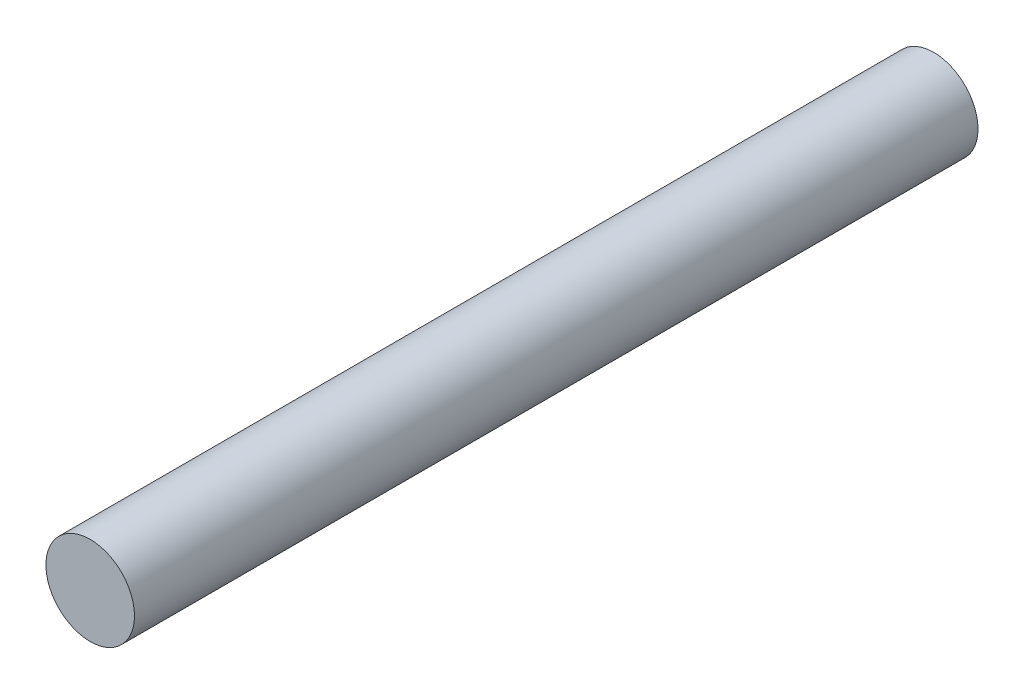
ISO-10303-21;
HEADER;
FILE_DESCRIPTION(('STEP AP214'),'2;1');
FILE_NAME('part.step','',(''),(''),'','','');
FILE_SCHEMA(('AUTOMOTIVE_DESIGN { 1 0 10303 214 1 1 1 1 }'));
ENDSEC;
DATA;
#1=APPLICATION_CONTEXT('core data for automotive mechanical design processes');
#2=APPLICATION_PROTOCOL_DEFINITION('international standard','automotive_design',2000,#1);
#3=PRODUCT_CONTEXT('',#1,'mechanical');
#4=PRODUCT('Part','Part','',(#3));
#5=PRODUCT_RELATED_PRODUCT_CATEGORY('part','',(#4));
#6=PRODUCT_DEFINITION_FORMATION('','',#4);
#7=PRODUCT_DEFINITION_CONTEXT('part definition',#1,'design');
#8=PRODUCT_DEFINITION('design','',#6,#7);
#9=PRODUCT_DEFINITION_SHAPE('','',#8);
#10=(LENGTH_UNIT() NAMED_UNIT(*) SI_UNIT(.MILLI.,.METRE.));
#11=(NAMED_UNIT(*) PLANE_ANGLE_UNIT() SI_UNIT($,.RADIAN.));
#12=(NAMED_UNIT(*) SI_UNIT($,.STERADIAN.) SOLID_ANGLE_UNIT());
#13=UNCERTAINTY_MEASURE_WITH_UNIT(LENGTH_MEASURE(1.E-05),#10,'distance_accuracy_value','');
#14=(GEOMETRIC_REPRESENTATION_CONTEXT(3) GLOBAL_UNCERTAINTY_ASSIGNED_CONTEXT((#13)) GLOBAL_UNIT_ASSIGNED_CONTEXT((#10,
#11,#12)) REPRESENTATION_CONTEXT('',''));
#15=CARTESIAN_POINT('',(0.,0.,0.));
#16=DIRECTION('',(0.,0.,1.));
#17=DIRECTION('',(1.,0.,0.));
#18=AXIS2_PLACEMENT_3D('',#15,#16,#17);
#19=CARTESIAN_POINT('',(0.,0.,40.));
#20=DIRECTION('',(0.,0.,-1.));
#21=DIRECTION('',(-1.,0.,0.));
#22=AXIS2_PLACEMENT_3D('',#19,#20,#21);
#23=CYLINDRICAL_SURFACE('',#22,2.1);
#24=CARTESIAN_POINT('',(0.,0.,40.));
#25=DIRECTION('',(0.,0.,1.));
#26=DIRECTION('',(1.,0.,0.));
#27=AXIS2_PLACEMENT_3D('',#24,#25,#26);
#28=CIRCLE('',#27,2.1);
#29=CARTESIAN_POINT('',(2.1,0.,40.));
#30=VERTEX_POINT('',#29);
#31=EDGE_CURVE('E10',#30,#30,#28,.T.);
#32=ORIENTED_EDGE('',*,*,#31,.F.);
#33=EDGE_LOOP('',(#32));
#34=FACE_BOUND('',#33,.T.);
#35=CARTESIAN_POINT('',(0.,0.,0.));
#36=DIRECTION('',(0.,0.,1.));
#37=DIRECTION('',(1.,0.,0.));
#38=AXIS2_PLACEMENT_3D('',#35,#36,#37);
#39=CIRCLE('',#38,2.1);
#40=CARTESIAN_POINT('',(2.1,0.,0.));
#41=VERTEX_POINT('',#40);
#42=EDGE_CURVE('E40',#41,#41,#39,.T.);
#43=ORIENTED_EDGE('',*,*,#42,.T.);
#44=EDGE_LOOP('',(#43));
#45=FACE_BOUND('',#44,.T.);
#46=ADVANCED_FACE('F37',(#34,#45),#23,.T.);
#47=CARTESIAN_POINT('',(0.,0.,40.));
#48=DIRECTION('',(0.,0.,1.));
#49=DIRECTION('',(1.,0.,0.));
#50=AXIS2_PLACEMENT_3D('',#47,#48,#49);
#51=PLANE('',#50);
#52=ORIENTED_EDGE('',*,*,#31,.T.);
#53=EDGE_LOOP('',(#52));
#54=FACE_BOUND('',#53,.T.);
#55=ADVANCED_FACE('F52',(#54),#51,.T.);
#56=CARTESIAN_POINT('',(0.,0.,0.));
#57=DIRECTION('',(0.,0.,1.));
#58=DIRECTION('',(1.,0.,0.));
#59=AXIS2_PLACEMENT_3D('',#56,#57,#58);
#60=PLANE('',#59);
#61=ORIENTED_EDGE('',*,*,#42,.F.);
#62=EDGE_LOOP('',(#61));
#63=FACE_BOUND('',#62,.T.);
#64=ADVANCED_FACE('F50',(#63),#60,.F.);
#65=CLOSED_SHELL('',(#46,#55,#64));
#66=MANIFOLD_SOLID_BREP('B2',#65);
#67=ADVANCED_BREP_SHAPE_REPRESENTATION('',(#18,#66),#14);
#68=SHAPE_DEFINITION_REPRESENTATION(#9,#67);
ENDSEC;
END-ISO-10303-21;
